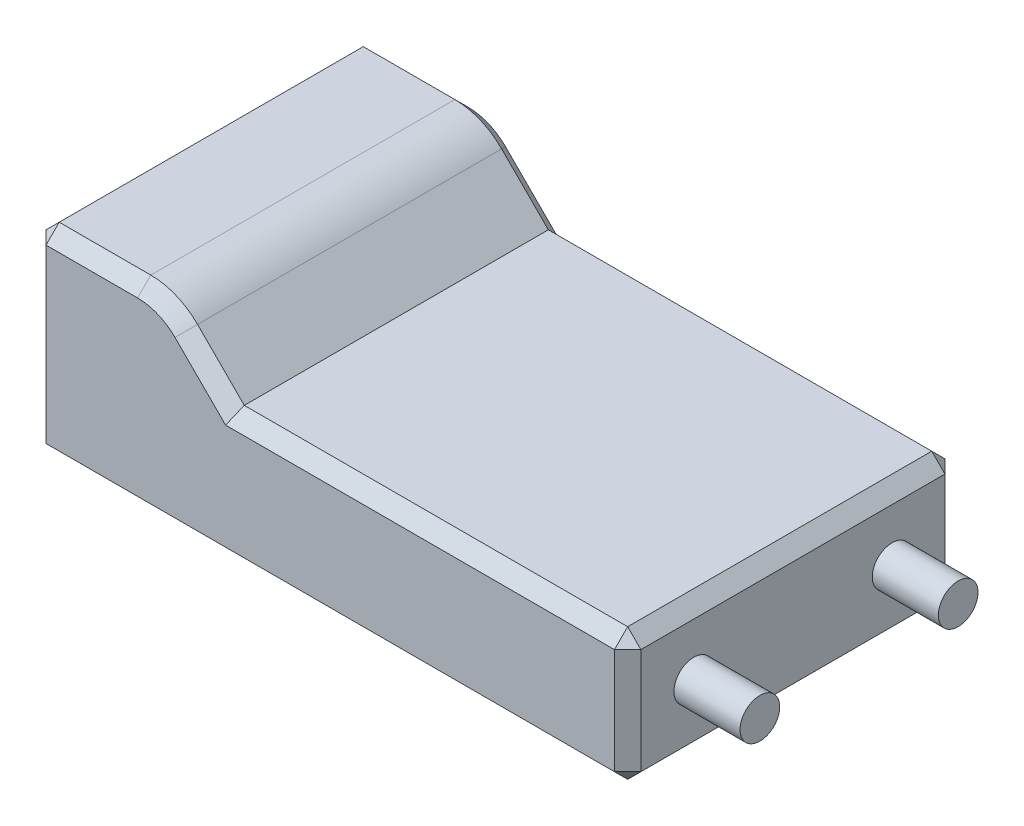
ISO-10303-21;
HEADER;
FILE_DESCRIPTION(('STEP AP214'),'2;1');
FILE_NAME('part.step','',(''),(''),'','','');
FILE_SCHEMA(('AUTOMOTIVE_DESIGN { 1 0 10303 214 1 1 1 1 }'));
ENDSEC;
DATA;
#1=APPLICATION_CONTEXT('core data for automotive mechanical design processes');
#2=APPLICATION_PROTOCOL_DEFINITION('international standard','automotive_design',2000,#1);
#3=PRODUCT_CONTEXT('',#1,'mechanical');
#4=PRODUCT('Part','Part','',(#3));
#5=PRODUCT_RELATED_PRODUCT_CATEGORY('part','',(#4));
#6=PRODUCT_DEFINITION_FORMATION('','',#4);
#7=PRODUCT_DEFINITION_CONTEXT('part definition',#1,'design');
#8=PRODUCT_DEFINITION('design','',#6,#7);
#9=PRODUCT_DEFINITION_SHAPE('','',#8);
#10=(LENGTH_UNIT() NAMED_UNIT(*) SI_UNIT(.MILLI.,.METRE.));
#11=(NAMED_UNIT(*) PLANE_ANGLE_UNIT() SI_UNIT($,.RADIAN.));
#12=(NAMED_UNIT(*) SI_UNIT($,.STERADIAN.) SOLID_ANGLE_UNIT());
#13=UNCERTAINTY_MEASURE_WITH_UNIT(LENGTH_MEASURE(1.E-05),#10,'distance_accuracy_value','');
#14=(GEOMETRIC_REPRESENTATION_CONTEXT(3) GLOBAL_UNCERTAINTY_ASSIGNED_CONTEXT((#13)) GLOBAL_UNIT_ASSIGNED_CONTEXT((#10,
#11,#12)) REPRESENTATION_CONTEXT('',''));
#15=CARTESIAN_POINT('',(0.,0.,0.));
#16=DIRECTION('',(0.,0.,1.));
#17=DIRECTION('',(1.,0.,0.));
#18=AXIS2_PLACEMENT_3D('',#15,#16,#17);
#19=CARTESIAN_POINT('',(-22.5,15.,0.));
#20=DIRECTION('',(1.,0.,0.));
#21=DIRECTION('',(0.,0.,-1.));
#22=AXIS2_PLACEMENT_3D('',#19,#20,#21);
#23=PLANE('',#22);
#24=DIRECTION('',(0.,-1.,0.));
#25=VECTOR('',#24,1.);
#26=CARTESIAN_POINT('',(-22.5,0.,10.));
#27=LINE('',#26,#25);
#28=CARTESIAN_POINT('',(-22.5,14.,10.));
#29=VERTEX_POINT('',#28);
#30=CARTESIAN_POINT('',(-22.5,1.,10.));
#31=VERTEX_POINT('',#30);
#32=EDGE_CURVE('E216',#29,#31,#27,.T.);
#33=ORIENTED_EDGE('',*,*,#32,.T.);
#34=DIRECTION('',(0.,0.,1.));
#35=VECTOR('',#34,1.);
#36=CARTESIAN_POINT('',(-22.5,1.00000000000001,0.));
#37=LINE('',#36,#35);
#38=CARTESIAN_POINT('',(-22.5,1.00000000000001,11.5));
#39=VERTEX_POINT('',#38);
#40=EDGE_CURVE('E320',#31,#39,#37,.T.);
#41=ORIENTED_EDGE('',*,*,#40,.T.);
#42=DIRECTION('',(0.,1.,0.));
#43=VECTOR('',#42,1.);
#44=CARTESIAN_POINT('',(-22.5,15.,11.5));
#45=LINE('',#44,#43);
#46=CARTESIAN_POINT('',(-22.5,14.,11.5));
#47=VERTEX_POINT('',#46);
#48=EDGE_CURVE('E317',#39,#47,#45,.T.);
#49=ORIENTED_EDGE('',*,*,#48,.T.);
#50=DIRECTION('',(0.,0.,-1.));
#51=VECTOR('',#50,1.);
#52=CARTESIAN_POINT('',(-22.5,14.,-12.5));
#53=LINE('',#52,#51);
#54=EDGE_CURVE('E315',#47,#29,#53,.T.);
#55=ORIENTED_EDGE('',*,*,#54,.T.);
#56=EDGE_LOOP('',(#33,#41,#49,#55));
#57=FACE_BOUND('',#56,.T.);
#58=ADVANCED_FACE('F47',(#57),#23,.F.);
#59=CARTESIAN_POINT('',(0.,10.,0.));
#60=DIRECTION('',(0.,1.,0.));
#61=DIRECTION('',(0.,0.,1.));
#62=AXIS2_PLACEMENT_3D('',#59,#60,#61);
#63=PLANE('',#62);
#64=DIRECTION('',(0.,0.,1.));
#65=VECTOR('',#64,1.);
#66=CARTESIAN_POINT('',(-7.49999999999988,10.,-12.5));
#67=LINE('',#66,#65);
#68=CARTESIAN_POINT('',(-7.49999999999988,10.,-11.5));
#69=VERTEX_POINT('',#68);
#70=CARTESIAN_POINT('',(-7.49999999999988,10.,11.5));
#71=VERTEX_POINT('',#70);
#72=EDGE_CURVE('E229',#69,#71,#67,.T.);
#73=ORIENTED_EDGE('',*,*,#72,.T.);
#74=DIRECTION('',(1.,0.,0.));
#75=VECTOR('',#74,1.);
#76=CARTESIAN_POINT('',(22.5,10.,11.5));
#77=LINE('',#76,#75);
#78=CARTESIAN_POINT('',(21.5,10.,11.5));
#79=VERTEX_POINT('',#78);
#80=EDGE_CURVE('E274',#71,#79,#77,.T.);
#81=ORIENTED_EDGE('',*,*,#80,.T.);
#82=DIRECTION('',(0.,0.,-1.));
#83=VECTOR('',#82,1.);
#84=CARTESIAN_POINT('',(21.5,10.,0.));
#85=LINE('',#84,#83);
#86=CARTESIAN_POINT('',(21.5,10.,-11.5));
#87=VERTEX_POINT('',#86);
#88=EDGE_CURVE('E270',#79,#87,#85,.T.);
#89=ORIENTED_EDGE('',*,*,#88,.T.);
#90=DIRECTION('',(-1.,0.,0.));
#91=VECTOR('',#90,1.);
#92=CARTESIAN_POINT('',(0.,10.,-11.5));
#93=LINE('',#92,#91);
#94=EDGE_CURVE('E272',#87,#69,#93,.T.);
#95=ORIENTED_EDGE('',*,*,#94,.T.);
#96=EDGE_LOOP('',(#73,#81,#89,#95));
#97=FACE_BOUND('',#96,.T.);
#98=ADVANCED_FACE('F441',(#97),#63,.T.);
#99=DIRECTION('',(0.,-1.,0.));
#100=VECTOR('',#99,1.);
#101=CARTESIAN_POINT('',(-22.5,0.,-11.5));
#102=LINE('',#101,#100);
#103=CARTESIAN_POINT('',(-22.5,14.,-11.5));
#104=VERTEX_POINT('',#103);
#105=CARTESIAN_POINT('',(-22.5,1.00000000000001,-11.5));
#106=VERTEX_POINT('',#105);
#107=EDGE_CURVE('E311',#104,#106,#102,.T.);
#108=ORIENTED_EDGE('',*,*,#107,.T.);
#109=DIRECTION('',(0.,0.,1.));
#110=VECTOR('',#109,1.);
#111=CARTESIAN_POINT('',(-22.5,1.00000000000001,0.));
#112=LINE('',#111,#110);
#113=CARTESIAN_POINT('',(-22.5,1.,-10.));
#114=VERTEX_POINT('',#113);
#115=EDGE_CURVE('E313',#106,#114,#112,.T.);
#116=ORIENTED_EDGE('',*,*,#115,.T.);
#117=DIRECTION('',(0.,-1.,0.));
#118=VECTOR('',#117,1.);
#119=CARTESIAN_POINT('',(-22.5,0.,-10.));
#120=LINE('',#119,#118);
#121=CARTESIAN_POINT('',(-22.5,14.,-10.));
#122=VERTEX_POINT('',#121);
#123=EDGE_CURVE('E228',#122,#114,#120,.T.);
#124=ORIENTED_EDGE('',*,*,#123,.F.);
#125=DIRECTION('',(0.,0.,-1.));
#126=VECTOR('',#125,1.);
#127=CARTESIAN_POINT('',(-22.5,14.,-12.5));
#128=LINE('',#127,#126);
#129=EDGE_CURVE('E309',#122,#104,#128,.T.);
#130=ORIENTED_EDGE('',*,*,#129,.T.);
#131=EDGE_LOOP('',(#108,#116,#124,#130));
#132=FACE_BOUND('',#131,.T.);
#133=ADVANCED_FACE('F444',(#132),#23,.F.);
#134=CARTESIAN_POINT('',(0.,10.,-12.5));
#135=DIRECTION('',(0.,0.,-1.));
#136=DIRECTION('',(-1.,0.,0.));
#137=AXIS2_PLACEMENT_3D('',#134,#135,#136);
#138=PLANE('',#137);
#139=CARTESIAN_POINT('',(-14.5710678118654,10.,-12.5));
#140=DIRECTION('',(0.,0.,-1.));
#141=DIRECTION('',(-1.,0.,0.));
#142=AXIS2_PLACEMENT_3D('',#139,#140,#141);
#143=CIRCLE('',#142,3.99999999999999);
#144=CARTESIAN_POINT('',(-14.5710678118654,14.,-12.5));
#145=VERTEX_POINT('',#144);
#146=CARTESIAN_POINT('',(-11.7426406871193,12.8284271247462,-12.5));
#147=VERTEX_POINT('',#146);
#148=EDGE_CURVE('E256',#145,#147,#143,.T.);
#149=ORIENTED_EDGE('',*,*,#148,.T.);
#150=DIRECTION('',(0.707106781186556,-0.707106781186539,0.));
#151=VECTOR('',#150,1.);
#152=CARTESIAN_POINT('',(-8.20710678118643,9.29289321881344,-12.5));
#153=LINE('',#152,#151);
#154=CARTESIAN_POINT('',(-7.91421356237297,8.99999999999999,-12.5));
#155=VERTEX_POINT('',#154);
#156=EDGE_CURVE('E258',#147,#155,#153,.T.);
#157=ORIENTED_EDGE('',*,*,#156,.T.);
#158=DIRECTION('',(1.,0.,0.));
#159=VECTOR('',#158,1.);
#160=CARTESIAN_POINT('',(0.,8.99999999999999,-12.5));
#161=LINE('',#160,#159);
#162=CARTESIAN_POINT('',(21.5,8.99999999999999,-12.5));
#163=VERTEX_POINT('',#162);
#164=EDGE_CURVE('E254',#155,#163,#161,.T.);
#165=ORIENTED_EDGE('',*,*,#164,.T.);
#166=DIRECTION('',(0.,-1.,0.));
#167=VECTOR('',#166,1.);
#168=CARTESIAN_POINT('',(21.5,10.,-12.5));
#169=LINE('',#168,#167);
#170=CARTESIAN_POINT('',(21.5,1.00000000000001,-12.5));
#171=VERTEX_POINT('',#170);
#172=EDGE_CURVE('E252',#163,#171,#169,.T.);
#173=ORIENTED_EDGE('',*,*,#172,.T.);
#174=DIRECTION('',(-1.,0.,0.));
#175=VECTOR('',#174,1.);
#176=CARTESIAN_POINT('',(-22.5,1.00000000000001,-12.5));
#177=LINE('',#176,#175);
#178=CARTESIAN_POINT('',(-21.5,1.00000000000001,-12.5));
#179=VERTEX_POINT('',#178);
#180=EDGE_CURVE('E250',#171,#179,#177,.T.);
#181=ORIENTED_EDGE('',*,*,#180,.T.);
#182=DIRECTION('',(0.,1.,0.));
#183=VECTOR('',#182,1.);
#184=CARTESIAN_POINT('',(-21.5,15.,-12.5));
#185=LINE('',#184,#183);
#186=CARTESIAN_POINT('',(-21.5,14.,-12.5));
#187=VERTEX_POINT('',#186);
#188=EDGE_CURVE('E248',#179,#187,#185,.T.);
#189=ORIENTED_EDGE('',*,*,#188,.T.);
#190=DIRECTION('',(1.,0.,0.));
#191=VECTOR('',#190,1.);
#192=CARTESIAN_POINT('',(0.,14.,-12.5));
#193=LINE('',#192,#191);
#194=EDGE_CURVE('E246',#187,#145,#193,.T.);
#195=ORIENTED_EDGE('',*,*,#194,.T.);
#196=EDGE_LOOP('',(#149,#157,#165,#173,#181,#189,#195));
#197=FACE_BOUND('',#196,.T.);
#198=ADVANCED_FACE('F451',(#197),#138,.T.);
#199=CARTESIAN_POINT('',(0.,10.,12.5));
#200=DIRECTION('',(0.,0.,-1.));
#201=DIRECTION('',(-1.,0.,0.));
#202=AXIS2_PLACEMENT_3D('',#199,#200,#201);
#203=PLANE('',#202);
#204=DIRECTION('',(0.,1.,0.));
#205=VECTOR('',#204,1.);
#206=CARTESIAN_POINT('',(21.5,10.,12.5));
#207=LINE('',#206,#205);
#208=CARTESIAN_POINT('',(21.5,1.00000000000001,12.5));
#209=VERTEX_POINT('',#208);
#210=CARTESIAN_POINT('',(21.5,8.99999999999999,12.5));
#211=VERTEX_POINT('',#210);
#212=EDGE_CURVE('E286',#209,#211,#207,.T.);
#213=ORIENTED_EDGE('',*,*,#212,.T.);
#214=DIRECTION('',(-1.,0.,0.));
#215=VECTOR('',#214,1.);
#216=CARTESIAN_POINT('',(-7.49999999999988,8.99999999999999,12.5));
#217=LINE('',#216,#215);
#218=CARTESIAN_POINT('',(-7.91421356237297,8.99999999999999,12.5));
#219=VERTEX_POINT('',#218);
#220=EDGE_CURVE('E288',#211,#219,#217,.T.);
#221=ORIENTED_EDGE('',*,*,#220,.T.);
#222=DIRECTION('',(-0.707106781186556,0.707106781186539,0.));
#223=VECTOR('',#222,1.);
#224=CARTESIAN_POINT('',(-4.45710678118639,5.5428932188135,12.5));
#225=LINE('',#224,#223);
#226=CARTESIAN_POINT('',(-11.7426406871193,12.8284271247462,12.5));
#227=VERTEX_POINT('',#226);
#228=EDGE_CURVE('E280',#219,#227,#225,.T.);
#229=ORIENTED_EDGE('',*,*,#228,.T.);
#230=CARTESIAN_POINT('',(-14.5710678118654,10.,12.5));
#231=DIRECTION('',(0.,0.,-1.));
#232=DIRECTION('',(-1.,0.,0.));
#233=AXIS2_PLACEMENT_3D('',#230,#231,#232);
#234=CIRCLE('',#233,3.99999999999999);
#235=CARTESIAN_POINT('',(-14.5710678118654,14.,12.5));
#236=VERTEX_POINT('',#235);
#237=EDGE_CURVE('E278',#227,#236,#234,.F.);
#238=ORIENTED_EDGE('',*,*,#237,.T.);
#239=DIRECTION('',(-1.,0.,0.));
#240=VECTOR('',#239,1.);
#241=CARTESIAN_POINT('',(-22.5,14.,12.5));
#242=LINE('',#241,#240);
#243=CARTESIAN_POINT('',(-21.5,14.,12.5));
#244=VERTEX_POINT('',#243);
#245=EDGE_CURVE('E276',#236,#244,#242,.T.);
#246=ORIENTED_EDGE('',*,*,#245,.T.);
#247=DIRECTION('',(0.,-1.,0.));
#248=VECTOR('',#247,1.);
#249=CARTESIAN_POINT('',(-21.5,10.,12.5));
#250=LINE('',#249,#248);
#251=CARTESIAN_POINT('',(-21.5,1.00000000000001,12.5));
#252=VERTEX_POINT('',#251);
#253=EDGE_CURVE('E282',#244,#252,#250,.T.);
#254=ORIENTED_EDGE('',*,*,#253,.T.);
#255=DIRECTION('',(1.,0.,0.));
#256=VECTOR('',#255,1.);
#257=CARTESIAN_POINT('',(0.,1.00000000000001,12.5));
#258=LINE('',#257,#256);
#259=EDGE_CURVE('E284',#252,#209,#258,.T.);
#260=ORIENTED_EDGE('',*,*,#259,.T.);
#261=EDGE_LOOP('',(#213,#221,#229,#238,#246,#254,#260));
#262=FACE_BOUND('',#261,.T.);
#263=ADVANCED_FACE('F456',(#262),#203,.F.);
#264=CARTESIAN_POINT('',(22.5,10.,0.));
#265=DIRECTION('',(1.,0.,0.));
#266=DIRECTION('',(0.,0.,-1.));
#267=AXIS2_PLACEMENT_3D('',#264,#265,#266);
#268=PLANE('',#267);
#269=CARTESIAN_POINT('',(22.5,5.00000000000001,-7.49999999999999));
#270=DIRECTION('',(1.,0.,0.));
#271=DIRECTION('',(0.,0.,-1.));
#272=AXIS2_PLACEMENT_3D('',#269,#270,#271);
#273=CIRCLE('',#272,1.5);
#274=CARTESIAN_POINT('',(22.5,5.00000000000001,-8.99999999999999));
#275=VERTEX_POINT('',#274);
#276=EDGE_CURVE('E11',#275,#275,#273,.T.);
#277=ORIENTED_EDGE('',*,*,#276,.F.);
#278=EDGE_LOOP('',(#277));
#279=FACE_BOUND('',#278,.T.);
#280=CARTESIAN_POINT('',(22.5,5.,7.49999999999999));
#281=DIRECTION('',(1.,0.,0.));
#282=DIRECTION('',(0.,0.,-1.));
#283=AXIS2_PLACEMENT_3D('',#280,#281,#282);
#284=CIRCLE('',#283,1.5);
#285=CARTESIAN_POINT('',(22.5,5.,5.99999999999999));
#286=VERTEX_POINT('',#285);
#287=EDGE_CURVE('E420',#286,#286,#284,.T.);
#288=ORIENTED_EDGE('',*,*,#287,.F.);
#289=EDGE_LOOP('',(#288));
#290=FACE_BOUND('',#289,.T.);
#291=DIRECTION('',(0.,0.,1.));
#292=VECTOR('',#291,1.);
#293=CARTESIAN_POINT('',(22.5,8.99999999999999,0.));
#294=LINE('',#293,#292);
#295=CARTESIAN_POINT('',(22.5,8.99999999999999,-11.5));
#296=VERTEX_POINT('',#295);
#297=CARTESIAN_POINT('',(22.5,8.99999999999999,11.5));
#298=VERTEX_POINT('',#297);
#299=EDGE_CURVE('E293',#296,#298,#294,.T.);
#300=ORIENTED_EDGE('',*,*,#299,.T.);
#301=DIRECTION('',(0.,-1.,0.));
#302=VECTOR('',#301,1.);
#303=CARTESIAN_POINT('',(22.5,0.,11.5));
#304=LINE('',#303,#302);
#305=CARTESIAN_POINT('',(22.5,1.00000000000001,11.5));
#306=VERTEX_POINT('',#305);
#307=EDGE_CURVE('E297',#298,#306,#304,.T.);
#308=ORIENTED_EDGE('',*,*,#307,.T.);
#309=DIRECTION('',(0.,0.,-1.));
#310=VECTOR('',#309,1.);
#311=CARTESIAN_POINT('',(22.5,1.00000000000001,-12.5));
#312=LINE('',#311,#310);
#313=CARTESIAN_POINT('',(22.5,1.00000000000001,-11.5));
#314=VERTEX_POINT('',#313);
#315=EDGE_CURVE('E295',#306,#314,#312,.T.);
#316=ORIENTED_EDGE('',*,*,#315,.T.);
#317=DIRECTION('',(0.,1.,0.));
#318=VECTOR('',#317,1.);
#319=CARTESIAN_POINT('',(22.5,10.,-11.5));
#320=LINE('',#319,#318);
#321=EDGE_CURVE('E291',#314,#296,#320,.T.);
#322=ORIENTED_EDGE('',*,*,#321,.T.);
#323=EDGE_LOOP('',(#300,#308,#316,#322));
#324=FACE_BOUND('',#323,.T.);
#325=ADVANCED_FACE('F503',(#279,#290,#324),#268,.T.);
#326=CARTESIAN_POINT('',(0.,0.,0.));
#327=DIRECTION('',(0.,1.,0.));
#328=DIRECTION('',(0.,0.,1.));
#329=AXIS2_PLACEMENT_3D('',#326,#327,#328);
#330=PLANE('',#329);
#331=DIRECTION('',(0.,0.,1.));
#332=VECTOR('',#331,1.);
#333=CARTESIAN_POINT('',(21.5,0.,12.5));
#334=LINE('',#333,#332);
#335=CARTESIAN_POINT('',(21.5,0.,-11.5));
#336=VERTEX_POINT('',#335);
#337=CARTESIAN_POINT('',(21.5,0.,11.5));
#338=VERTEX_POINT('',#337);
#339=EDGE_CURVE('E302',#336,#338,#334,.T.);
#340=ORIENTED_EDGE('',*,*,#339,.T.);
#341=DIRECTION('',(-1.,0.,0.));
#342=VECTOR('',#341,1.);
#343=CARTESIAN_POINT('',(0.,0.,11.5));
#344=LINE('',#343,#342);
#345=CARTESIAN_POINT('',(-21.5,0.,11.5));
#346=VERTEX_POINT('',#345);
#347=EDGE_CURVE('E306',#338,#346,#344,.T.);
#348=ORIENTED_EDGE('',*,*,#347,.T.);
#349=DIRECTION('',(0.,0.,-1.));
#350=VECTOR('',#349,1.);
#351=CARTESIAN_POINT('',(-21.5,0.,0.));
#352=LINE('',#351,#350);
#353=CARTESIAN_POINT('',(-21.5,0.,-11.5));
#354=VERTEX_POINT('',#353);
#355=EDGE_CURVE('E304',#346,#354,#352,.T.);
#356=ORIENTED_EDGE('',*,*,#355,.T.);
#357=DIRECTION('',(1.,0.,0.));
#358=VECTOR('',#357,1.);
#359=CARTESIAN_POINT('',(22.5,0.,-11.5));
#360=LINE('',#359,#358);
#361=EDGE_CURVE('E300',#354,#336,#360,.T.);
#362=ORIENTED_EDGE('',*,*,#361,.T.);
#363=EDGE_LOOP('',(#340,#348,#356,#362));
#364=FACE_BOUND('',#363,.T.);
#365=ADVANCED_FACE('F487',(#364),#330,.F.);
#366=CARTESIAN_POINT('',(0.,15.,0.));
#367=DIRECTION('',(0.,1.,0.));
#368=DIRECTION('',(0.,0.,1.));
#369=AXIS2_PLACEMENT_3D('',#366,#367,#368);
#370=PLANE('',#369);
#371=DIRECTION('',(0.,0.,1.));
#372=VECTOR('',#371,1.);
#373=CARTESIAN_POINT('',(-21.5,15.,12.5));
#374=LINE('',#373,#372);
#375=CARTESIAN_POINT('',(-21.5,15.,-11.5));
#376=VERTEX_POINT('',#375);
#377=CARTESIAN_POINT('',(-21.5,15.,11.5));
#378=VERTEX_POINT('',#377);
#379=EDGE_CURVE('E63',#376,#378,#374,.T.);
#380=ORIENTED_EDGE('',*,*,#379,.T.);
#381=DIRECTION('',(1.,0.,0.));
#382=VECTOR('',#381,1.);
#383=CARTESIAN_POINT('',(-14.5710678118654,15.,11.5));
#384=LINE('',#383,#382);
#385=CARTESIAN_POINT('',(-14.5710678118654,15.,11.5));
#386=VERTEX_POINT('',#385);
#387=EDGE_CURVE('E56',#378,#386,#384,.T.);
#388=ORIENTED_EDGE('',*,*,#387,.T.);
#389=DIRECTION('',(0.,0.,1.));
#390=VECTOR('',#389,1.);
#391=CARTESIAN_POINT('',(-14.5710678118654,15.,-12.5));
#392=LINE('',#391,#390);
#393=CARTESIAN_POINT('',(-14.5710678118654,15.,-11.5));
#394=VERTEX_POINT('',#393);
#395=EDGE_CURVE('E244',#386,#394,#392,.F.);
#396=ORIENTED_EDGE('',*,*,#395,.T.);
#397=DIRECTION('',(-1.,0.,0.));
#398=VECTOR('',#397,1.);
#399=CARTESIAN_POINT('',(0.,15.,-11.5));
#400=LINE('',#399,#398);
#401=EDGE_CURVE('E68',#394,#376,#400,.T.);
#402=ORIENTED_EDGE('',*,*,#401,.T.);
#403=EDGE_LOOP('',(#380,#388,#396,#402));
#404=FACE_BOUND('',#403,.T.);
#405=ADVANCED_FACE('F539',(#404),#370,.T.);
#406=CARTESIAN_POINT('',(-15.5,14.,0.));
#407=DIRECTION('',(0.,-1.,0.));
#408=DIRECTION('',(0.,0.,-1.));
#409=AXIS2_PLACEMENT_3D('',#406,#407,#408);
#410=PLANE('',#409);
#411=DIRECTION('',(0.,0.,1.));
#412=VECTOR('',#411,1.);
#413=CARTESIAN_POINT('',(-22.5,14.,0.));
#414=LINE('',#413,#412);
#415=EDGE_CURVE('E203',#122,#29,#414,.T.);
#416=ORIENTED_EDGE('',*,*,#415,.F.);
#417=DIRECTION('',(-1.,0.,0.));
#418=VECTOR('',#417,1.);
#419=CARTESIAN_POINT('',(-15.5,14.,-10.));
#420=LINE('',#419,#418);
#421=CARTESIAN_POINT('',(-15.5,14.,-10.));
#422=VERTEX_POINT('',#421);
#423=EDGE_CURVE('E196',#422,#122,#420,.T.);
#424=ORIENTED_EDGE('',*,*,#423,.F.);
#425=DIRECTION('',(0.,0.,1.));
#426=VECTOR('',#425,1.);
#427=CARTESIAN_POINT('',(-15.5,14.,0.));
#428=LINE('',#427,#426);
#429=CARTESIAN_POINT('',(-15.5,14.,10.));
#430=VERTEX_POINT('',#429);
#431=EDGE_CURVE('E200',#422,#430,#428,.T.);
#432=ORIENTED_EDGE('',*,*,#431,.T.);
#433=DIRECTION('',(-1.,0.,0.));
#434=VECTOR('',#433,1.);
#435=CARTESIAN_POINT('',(-15.5,14.,10.));
#436=LINE('',#435,#434);
#437=EDGE_CURVE('E236',#430,#29,#436,.T.);
#438=ORIENTED_EDGE('',*,*,#437,.T.);
#439=EDGE_LOOP('',(#416,#424,#432,#438));
#440=FACE_BOUND('',#439,.T.);
#441=ADVANCED_FACE('F198',(#440),#410,.T.);
#442=CARTESIAN_POINT('',(-15.5,0.,10.));
#443=DIRECTION('',(0.,0.,-1.));
#444=DIRECTION('',(-1.,0.,0.));
#445=AXIS2_PLACEMENT_3D('',#442,#443,#444);
#446=PLANE('',#445);
#447=ORIENTED_EDGE('',*,*,#32,.F.);
#448=ORIENTED_EDGE('',*,*,#437,.F.);
#449=DIRECTION('',(0.,-1.,0.));
#450=VECTOR('',#449,1.);
#451=CARTESIAN_POINT('',(-15.5,0.,10.));
#452=LINE('',#451,#450);
#453=CARTESIAN_POINT('',(-15.5,1.,10.));
#454=VERTEX_POINT('',#453);
#455=EDGE_CURVE('E209',#430,#454,#452,.T.);
#456=ORIENTED_EDGE('',*,*,#455,.T.);
#457=DIRECTION('',(-1.,0.,0.));
#458=VECTOR('',#457,1.);
#459=CARTESIAN_POINT('',(-15.5,1.,10.));
#460=LINE('',#459,#458);
#461=EDGE_CURVE('E239',#454,#31,#460,.T.);
#462=ORIENTED_EDGE('',*,*,#461,.T.);
#463=EDGE_LOOP('',(#447,#448,#456,#462));
#464=FACE_BOUND('',#463,.T.);
#465=ADVANCED_FACE('F986',(#464),#446,.T.);
#466=CARTESIAN_POINT('',(-15.5,1.,0.));
#467=DIRECTION('',(0.,-1.,0.));
#468=DIRECTION('',(0.,0.,-1.));
#469=AXIS2_PLACEMENT_3D('',#466,#467,#468);
#470=PLANE('',#469);
#471=DIRECTION('',(0.,0.,1.));
#472=VECTOR('',#471,1.);
#473=CARTESIAN_POINT('',(-22.5,1.,0.));
#474=LINE('',#473,#472);
#475=EDGE_CURVE('E231',#114,#31,#474,.T.);
#476=ORIENTED_EDGE('',*,*,#475,.T.);
#477=ORIENTED_EDGE('',*,*,#461,.F.);
#478=DIRECTION('',(0.,0.,1.));
#479=VECTOR('',#478,1.);
#480=CARTESIAN_POINT('',(-15.5,1.,0.));
#481=LINE('',#480,#479);
#482=CARTESIAN_POINT('',(-15.5,1.,-10.));
#483=VERTEX_POINT('',#482);
#484=EDGE_CURVE('E221',#483,#454,#481,.T.);
#485=ORIENTED_EDGE('',*,*,#484,.F.);
#486=DIRECTION('',(-1.,0.,0.));
#487=VECTOR('',#486,1.);
#488=CARTESIAN_POINT('',(-15.5,1.,-10.));
#489=LINE('',#488,#487);
#490=EDGE_CURVE('E208',#483,#114,#489,.T.);
#491=ORIENTED_EDGE('',*,*,#490,.T.);
#492=EDGE_LOOP('',(#476,#477,#485,#491));
#493=FACE_BOUND('',#492,.T.);
#494=ADVANCED_FACE('F977',(#493),#470,.F.);
#495=CARTESIAN_POINT('',(-15.5,0.,-10.));
#496=DIRECTION('',(0.,0.,-1.));
#497=DIRECTION('',(-1.,0.,0.));
#498=AXIS2_PLACEMENT_3D('',#495,#496,#497);
#499=PLANE('',#498);
#500=ORIENTED_EDGE('',*,*,#123,.T.);
#501=ORIENTED_EDGE('',*,*,#490,.F.);
#502=DIRECTION('',(0.,-1.,0.));
#503=VECTOR('',#502,1.);
#504=CARTESIAN_POINT('',(-15.5,0.,-10.));
#505=LINE('',#504,#503);
#506=EDGE_CURVE('E215',#422,#483,#505,.T.);
#507=ORIENTED_EDGE('',*,*,#506,.F.);
#508=ORIENTED_EDGE('',*,*,#423,.T.);
#509=EDGE_LOOP('',(#500,#501,#507,#508));
#510=FACE_BOUND('',#509,.T.);
#511=ADVANCED_FACE('F218',(#510),#499,.F.);
#512=CARTESIAN_POINT('',(-15.5,0.,0.));
#513=DIRECTION('',(-1.,0.,0.));
#514=DIRECTION('',(0.,0.,1.));
#515=AXIS2_PLACEMENT_3D('',#512,#513,#514);
#516=PLANE('',#515);
#517=ORIENTED_EDGE('',*,*,#431,.F.);
#518=ORIENTED_EDGE('',*,*,#506,.T.);
#519=ORIENTED_EDGE('',*,*,#484,.T.);
#520=ORIENTED_EDGE('',*,*,#455,.F.);
#521=EDGE_LOOP('',(#517,#518,#519,#520));
#522=FACE_BOUND('',#521,.T.);
#523=ADVANCED_FACE('F213',(#522),#516,.T.);
#524=CARTESIAN_POINT('',(1.25000000000015,1.25000000000018,-12.5));
#525=DIRECTION('',(-0.707106781186539,-0.707106781186556,0.));
#526=DIRECTION('',(0.707106781186556,-0.707106781186539,0.));
#527=AXIS2_PLACEMENT_3D('',#524,#525,#526);
#528=PLANE('',#527);
#529=ORIENTED_EDGE('',*,*,#72,.F.);
#530=DIRECTION('',(-0.707106781186556,0.707106781186539,0.));
#531=VECTOR('',#530,1.);
#532=CARTESIAN_POINT('',(-11.0355339059327,13.5355339059328,-11.5));
#533=LINE('',#532,#531);
#534=CARTESIAN_POINT('',(-11.0355339059327,13.5355339059328,-11.5));
#535=VERTEX_POINT('',#534);
#536=EDGE_CURVE('E263',#69,#535,#533,.T.);
#537=ORIENTED_EDGE('',*,*,#536,.T.);
#538=DIRECTION('',(0.,0.,1.));
#539=VECTOR('',#538,1.);
#540=CARTESIAN_POINT('',(-11.0355339059327,13.5355339059328,12.5));
#541=LINE('',#540,#539);
#542=CARTESIAN_POINT('',(-11.0355339059327,13.5355339059328,11.5));
#543=VERTEX_POINT('',#542);
#544=EDGE_CURVE('E238',#535,#543,#541,.T.);
#545=ORIENTED_EDGE('',*,*,#544,.T.);
#546=DIRECTION('',(0.707106781186556,-0.707106781186539,0.));
#547=VECTOR('',#546,1.);
#548=CARTESIAN_POINT('',(1.25000000000015,1.25000000000018,11.5));
#549=LINE('',#548,#547);
#550=EDGE_CURVE('E261',#543,#71,#549,.T.);
#551=ORIENTED_EDGE('',*,*,#550,.T.);
#552=EDGE_LOOP('',(#529,#537,#545,#551));
#553=FACE_BOUND('',#552,.T.);
#554=ADVANCED_FACE('F524',(#553),#528,.F.);
#555=CARTESIAN_POINT('',(-14.5710678118654,10.,-12.5));
#556=DIRECTION('',(0.,0.,-1.));
#557=DIRECTION('',(-1.,0.,0.));
#558=AXIS2_PLACEMENT_3D('',#555,#556,#557);
#559=CYLINDRICAL_SURFACE('',#558,5.);
#560=ORIENTED_EDGE('',*,*,#544,.F.);
#561=CARTESIAN_POINT('',(-14.5710678118654,10.,-11.5));
#562=DIRECTION('',(0.,0.,-1.));
#563=DIRECTION('',(-1.,0.,0.));
#564=AXIS2_PLACEMENT_3D('',#561,#562,#563);
#565=CIRCLE('',#564,5.);
#566=EDGE_CURVE('E268',#535,#394,#565,.F.);
#567=ORIENTED_EDGE('',*,*,#566,.T.);
#568=ORIENTED_EDGE('',*,*,#395,.F.);
#569=CARTESIAN_POINT('',(-14.5710678118654,10.,11.5));
#570=DIRECTION('',(0.,0.,-1.));
#571=DIRECTION('',(-1.,0.,0.));
#572=AXIS2_PLACEMENT_3D('',#569,#570,#571);
#573=CIRCLE('',#572,5.);
#574=EDGE_CURVE('E266',#386,#543,#573,.T.);
#575=ORIENTED_EDGE('',*,*,#574,.T.);
#576=EDGE_LOOP('',(#560,#567,#568,#575));
#577=FACE_BOUND('',#576,.T.);
#578=ADVANCED_FACE('F537',(#577),#559,.T.);
#579=CARTESIAN_POINT('',(-21.5,0.,11.5));
#580=DIRECTION('',(-0.577350269189626,-0.577350269189626,0.577350269189626));
#581=DIRECTION('',(0.707106781186547,0.,0.707106781186547));
#582=AXIS2_PLACEMENT_3D('',#579,#580,#581);
#583=PLANE('',#582);
#584=DIRECTION('',(-0.707106781186547,0.707106781186547,0.));
#585=VECTOR('',#584,1.);
#586=CARTESIAN_POINT('',(-21.5,0.,11.5));
#587=LINE('',#586,#585);
#588=EDGE_CURVE('E401',#346,#39,#587,.T.);
#589=ORIENTED_EDGE('',*,*,#588,.F.);
#590=DIRECTION('',(0.,-0.707106781186547,-0.707106781186547));
#591=VECTOR('',#590,1.);
#592=CARTESIAN_POINT('',(-21.5,0.,11.5));
#593=LINE('',#592,#591);
#594=EDGE_CURVE('E409',#252,#346,#593,.T.);
#595=ORIENTED_EDGE('',*,*,#594,.F.);
#596=DIRECTION('',(0.707106781186547,0.,0.707106781186547));
#597=VECTOR('',#596,1.);
#598=CARTESIAN_POINT('',(-22.,1.00000000000001,12.));
#599=LINE('',#598,#597);
#600=EDGE_CURVE('E404',#39,#252,#599,.T.);
#601=ORIENTED_EDGE('',*,*,#600,.F.);
#602=EDGE_LOOP('',(#589,#595,#601));
#603=FACE_BOUND('',#602,.T.);
#604=ADVANCED_FACE('F50',(#603),#583,.T.);
#605=CARTESIAN_POINT('',(0.,1.00000000000001,12.5));
#606=DIRECTION('',(0.,0.707106781186547,-0.707106781186547));
#607=DIRECTION('',(1.,0.,0.));
#608=AXIS2_PLACEMENT_3D('',#605,#606,#607);
#609=PLANE('',#608);
#610=ORIENTED_EDGE('',*,*,#594,.T.);
#611=ORIENTED_EDGE('',*,*,#347,.F.);
#612=DIRECTION('',(0.,0.707106781186547,0.707106781186547));
#613=VECTOR('',#612,1.);
#614=CARTESIAN_POINT('',(21.5,0.500000000000004,12.));
#615=LINE('',#614,#613);
#616=EDGE_CURVE('E398',#209,#338,#615,.F.);
#617=ORIENTED_EDGE('',*,*,#616,.F.);
#618=ORIENTED_EDGE('',*,*,#259,.F.);
#619=EDGE_LOOP('',(#610,#611,#617,#618));
#620=FACE_BOUND('',#619,.T.);
#621=ADVANCED_FACE('F559',(#620),#609,.F.);
#622=CARTESIAN_POINT('',(-14.5710678118654,10.,12.5));
#623=DIRECTION('',(0.,0.,-1.));
#624=DIRECTION('',(-1.,0.,0.));
#625=AXIS2_PLACEMENT_3D('',#622,#623,#624);
#626=CONICAL_SURFACE('',#625,3.99999999999999,0.785398163397448);
#627=DIRECTION('',(-0.499999999999994,-0.500000000000006,0.707106781186548));
#628=VECTOR('',#627,1.);
#629=CARTESIAN_POINT('',(-11.0355339059327,13.5355339059328,11.5));
#630=LINE('',#629,#628);
#631=EDGE_CURVE('E395',#543,#227,#630,.T.);
#632=ORIENTED_EDGE('',*,*,#631,.F.);
#633=ORIENTED_EDGE('',*,*,#574,.F.);
#634=DIRECTION('',(0.,0.707106781186547,-0.707106781186547));
#635=VECTOR('',#634,1.);
#636=CARTESIAN_POINT('',(-14.5710678118654,14.,12.5));
#637=LINE('',#636,#635);
#638=EDGE_CURVE('E407',#236,#386,#637,.T.);
#639=ORIENTED_EDGE('',*,*,#638,.F.);
#640=ORIENTED_EDGE('',*,*,#237,.F.);
#641=EDGE_LOOP('',(#632,#633,#639,#640));
#642=FACE_BOUND('',#641,.T.);
#643=ADVANCED_FACE('F569',(#642),#626,.T.);
#644=CARTESIAN_POINT('',(0.,15.,11.5));
#645=DIRECTION('',(0.,0.707106781186547,0.707106781186547));
#646=DIRECTION('',(-1.,0.,0.));
#647=AXIS2_PLACEMENT_3D('',#644,#645,#646);
#648=PLANE('',#647);
#649=ORIENTED_EDGE('',*,*,#638,.T.);
#650=ORIENTED_EDGE('',*,*,#387,.F.);
#651=DIRECTION('',(0.,0.707106781186547,-0.707106781186547));
#652=VECTOR('',#651,1.);
#653=CARTESIAN_POINT('',(-21.5,14.5,12.));
#654=LINE('',#653,#652);
#655=EDGE_CURVE('E392',#244,#378,#654,.T.);
#656=ORIENTED_EDGE('',*,*,#655,.F.);
#657=ORIENTED_EDGE('',*,*,#245,.F.);
#658=EDGE_LOOP('',(#649,#650,#656,#657));
#659=FACE_BOUND('',#658,.T.);
#660=ADVANCED_FACE('F566',(#659),#648,.T.);
#661=CARTESIAN_POINT('',(-21.5,10.,12.5));
#662=DIRECTION('',(0.707106781186547,0.,-0.707106781186547));
#663=DIRECTION('',(0.,-1.,0.));
#664=AXIS2_PLACEMENT_3D('',#661,#662,#663);
#665=PLANE('',#664);
#666=ORIENTED_EDGE('',*,*,#600,.T.);
#667=ORIENTED_EDGE('',*,*,#253,.F.);
#668=DIRECTION('',(-0.707106781186547,0.,-0.707106781186547));
#669=VECTOR('',#668,1.);
#670=CARTESIAN_POINT('',(-22.5,14.,11.5));
#671=LINE('',#670,#669);
#672=EDGE_CURVE('E389',#47,#244,#671,.F.);
#673=ORIENTED_EDGE('',*,*,#672,.F.);
#674=ORIENTED_EDGE('',*,*,#48,.F.);
#675=EDGE_LOOP('',(#666,#667,#673,#674));
#676=FACE_BOUND('',#675,.T.);
#677=ADVANCED_FACE('F554',(#676),#665,.F.);
#678=CARTESIAN_POINT('',(-22.5,1.00000000000001,0.));
#679=DIRECTION('',(0.707106781186547,0.707106781186547,0.));
#680=DIRECTION('',(0.,0.,1.));
#681=AXIS2_PLACEMENT_3D('',#678,#679,#680);
#682=PLANE('',#681);
#683=ORIENTED_EDGE('',*,*,#475,.F.);
#684=ORIENTED_EDGE('',*,*,#115,.F.);
#685=DIRECTION('',(0.707106781186547,-0.707106781186547,0.));
#686=VECTOR('',#685,1.);
#687=CARTESIAN_POINT('',(-21.5,0.,-11.5));
#688=LINE('',#687,#686);
#689=EDGE_CURVE('E386',#354,#106,#688,.F.);
#690=ORIENTED_EDGE('',*,*,#689,.F.);
#691=ORIENTED_EDGE('',*,*,#355,.F.);
#692=ORIENTED_EDGE('',*,*,#588,.T.);
#693=ORIENTED_EDGE('',*,*,#40,.F.);
#694=EDGE_LOOP('',(#683,#684,#690,#691,#692,#693));
#695=FACE_BOUND('',#694,.T.);
#696=ADVANCED_FACE('F468',(#695),#682,.F.);
#697=CARTESIAN_POINT('',(22.5,1.00000000000001,11.5));
#698=DIRECTION('',(0.577350269189626,-0.577350269189626,0.577350269189626));
#699=DIRECTION('',(0.707106781186547,0.,-0.707106781186547));
#700=AXIS2_PLACEMENT_3D('',#697,#698,#699);
#701=PLANE('',#700);
#702=DIRECTION('',(-0.707106781186547,0.,0.707106781186547));
#703=VECTOR('',#702,1.);
#704=CARTESIAN_POINT('',(22.5,1.00000000000001,11.5));
#705=LINE('',#704,#703);
#706=EDGE_CURVE('E377',#209,#306,#705,.F.);
#707=ORIENTED_EDGE('',*,*,#706,.F.);
#708=ORIENTED_EDGE('',*,*,#616,.T.);
#709=DIRECTION('',(0.707106781186547,0.707106781186547,0.));
#710=VECTOR('',#709,1.);
#711=CARTESIAN_POINT('',(22.5,1.00000000000001,11.5));
#712=LINE('',#711,#710);
#713=EDGE_CURVE('E380',#306,#338,#712,.F.);
#714=ORIENTED_EDGE('',*,*,#713,.F.);
#715=EDGE_LOOP('',(#707,#708,#714));
#716=FACE_BOUND('',#715,.T.);
#717=ADVANCED_FACE('F495',(#716),#701,.T.);
#718=CARTESIAN_POINT('',(1.25000000000015,1.25000000000018,11.5));
#719=DIRECTION('',(-0.499999999999994,-0.500000000000006,-0.707106781186547));
#720=DIRECTION('',(0.707106781186556,-0.707106781186539,0.));
#721=AXIS2_PLACEMENT_3D('',#718,#719,#720);
#722=PLANE('',#721);
#723=ORIENTED_EDGE('',*,*,#631,.T.);
#724=ORIENTED_EDGE('',*,*,#228,.F.);
#725=DIRECTION('',(-0.281084637714816,-0.678598344545848,0.678598344545848));
#726=VECTOR('',#725,1.);
#727=CARTESIAN_POINT('',(-6.90743569830537,11.4305767737291,10.0694232262709));
#728=LINE('',#727,#726);
#729=EDGE_CURVE('E375',#71,#219,#728,.T.);
#730=ORIENTED_EDGE('',*,*,#729,.F.);
#731=ORIENTED_EDGE('',*,*,#550,.F.);
#732=EDGE_LOOP('',(#723,#724,#730,#731));
#733=FACE_BOUND('',#732,.T.);
#734=ADVANCED_FACE('F572',(#733),#722,.F.);
#735=CARTESIAN_POINT('',(-22.5,14.,11.5));
#736=DIRECTION('',(-0.577350269189626,0.577350269189626,0.577350269189626));
#737=DIRECTION('',(0.707106781186547,0.,0.707106781186547));
#738=AXIS2_PLACEMENT_3D('',#735,#736,#737);
#739=PLANE('',#738);
#740=ORIENTED_EDGE('',*,*,#672,.T.);
#741=ORIENTED_EDGE('',*,*,#655,.T.);
#742=DIRECTION('',(-0.707106781186547,-0.707106781186547,0.));
#743=VECTOR('',#742,1.);
#744=CARTESIAN_POINT('',(-22.5,14.,11.5));
#745=LINE('',#744,#743);
#746=EDGE_CURVE('E372',#47,#378,#745,.F.);
#747=ORIENTED_EDGE('',*,*,#746,.F.);
#748=EDGE_LOOP('',(#740,#741,#747));
#749=FACE_BOUND('',#748,.T.);
#750=ADVANCED_FACE('F549',(#749),#739,.T.);
#751=CARTESIAN_POINT('',(-21.5,0.,-11.5));
#752=DIRECTION('',(-0.577350269189626,-0.577350269189626,-0.577350269189626));
#753=DIRECTION('',(-0.707106781186547,0.,0.707106781186547));
#754=AXIS2_PLACEMENT_3D('',#751,#752,#753);
#755=PLANE('',#754);
#756=DIRECTION('',(0.707106781186547,0.,-0.707106781186547));
#757=VECTOR('',#756,1.);
#758=CARTESIAN_POINT('',(-22.,1.00000000000001,-12.));
#759=LINE('',#758,#757);
#760=EDGE_CURVE('E369',#179,#106,#759,.F.);
#761=ORIENTED_EDGE('',*,*,#760,.F.);
#762=DIRECTION('',(0.,-0.707106781186547,0.707106781186547));
#763=VECTOR('',#762,1.);
#764=CARTESIAN_POINT('',(-21.5,0.,-11.5));
#765=LINE('',#764,#763);
#766=EDGE_CURVE('E383',#354,#179,#765,.F.);
#767=ORIENTED_EDGE('',*,*,#766,.F.);
#768=ORIENTED_EDGE('',*,*,#689,.T.);
#769=EDGE_LOOP('',(#761,#767,#768));
#770=FACE_BOUND('',#769,.T.);
#771=ADVANCED_FACE('F473',(#770),#755,.T.);
#772=CARTESIAN_POINT('',(0.,0.,-11.5));
#773=DIRECTION('',(0.,-0.707106781186547,-0.707106781186547));
#774=DIRECTION('',(-1.,0.,0.));
#775=AXIS2_PLACEMENT_3D('',#772,#773,#774);
#776=PLANE('',#775);
#777=ORIENTED_EDGE('',*,*,#766,.T.);
#778=ORIENTED_EDGE('',*,*,#180,.F.);
#779=DIRECTION('',(0.,0.707106781186547,-0.707106781186547));
#780=VECTOR('',#779,1.);
#781=CARTESIAN_POINT('',(21.5,0.500000000000004,-12.));
#782=LINE('',#781,#780);
#783=EDGE_CURVE('E366',#336,#171,#782,.T.);
#784=ORIENTED_EDGE('',*,*,#783,.F.);
#785=ORIENTED_EDGE('',*,*,#361,.F.);
#786=EDGE_LOOP('',(#777,#778,#784,#785));
#787=FACE_BOUND('',#786,.T.);
#788=ADVANCED_FACE('F484',(#787),#776,.T.);
#789=CARTESIAN_POINT('',(21.5,0.,0.));
#790=DIRECTION('',(0.707106781186547,-0.707106781186547,0.));
#791=DIRECTION('',(0.,0.,-1.));
#792=AXIS2_PLACEMENT_3D('',#789,#790,#791);
#793=PLANE('',#792);
#794=ORIENTED_EDGE('',*,*,#713,.T.);
#795=ORIENTED_EDGE('',*,*,#339,.F.);
#796=DIRECTION('',(-0.707106781186547,-0.707106781186547,0.));
#797=VECTOR('',#796,1.);
#798=CARTESIAN_POINT('',(22.5,1.00000000000001,-11.5));
#799=LINE('',#798,#797);
#800=EDGE_CURVE('E363',#314,#336,#799,.T.);
#801=ORIENTED_EDGE('',*,*,#800,.F.);
#802=ORIENTED_EDGE('',*,*,#315,.F.);
#803=EDGE_LOOP('',(#794,#795,#801,#802));
#804=FACE_BOUND('',#803,.T.);
#805=ADVANCED_FACE('F490',(#804),#793,.T.);
#806=CARTESIAN_POINT('',(22.5,10.,11.5));
#807=DIRECTION('',(0.707106781186547,0.,0.707106781186547));
#808=DIRECTION('',(0.,1.,0.));
#809=AXIS2_PLACEMENT_3D('',#806,#807,#808);
#810=PLANE('',#809);
#811=ORIENTED_EDGE('',*,*,#706,.T.);
#812=ORIENTED_EDGE('',*,*,#307,.F.);
#813=DIRECTION('',(0.707106781186547,0.,-0.707106781186547));
#814=VECTOR('',#813,1.);
#815=CARTESIAN_POINT('',(22.,8.99999999999999,12.));
#816=LINE('',#815,#814);
#817=EDGE_CURVE('E360',#211,#298,#816,.T.);
#818=ORIENTED_EDGE('',*,*,#817,.F.);
#819=ORIENTED_EDGE('',*,*,#212,.F.);
#820=EDGE_LOOP('',(#811,#812,#818,#819));
#821=FACE_BOUND('',#820,.T.);
#822=ADVANCED_FACE('F500',(#821),#810,.T.);
#823=CARTESIAN_POINT('',(0.,10.,11.5));
#824=DIRECTION('',(0.,0.707106781186547,0.707106781186547));
#825=DIRECTION('',(-1.,0.,0.));
#826=AXIS2_PLACEMENT_3D('',#823,#824,#825);
#827=PLANE('',#826);
#828=ORIENTED_EDGE('',*,*,#729,.T.);
#829=ORIENTED_EDGE('',*,*,#220,.F.);
#830=DIRECTION('',(0.,-0.707106781186547,0.707106781186547));
#831=VECTOR('',#830,1.);
#832=CARTESIAN_POINT('',(21.5,10.,11.5));
#833=LINE('',#832,#831);
#834=EDGE_CURVE('E357',#79,#211,#833,.T.);
#835=ORIENTED_EDGE('',*,*,#834,.F.);
#836=ORIENTED_EDGE('',*,*,#80,.F.);
#837=EDGE_LOOP('',(#828,#829,#835,#836));
#838=FACE_BOUND('',#837,.T.);
#839=ADVANCED_FACE('F576',(#838),#827,.T.);
#840=CARTESIAN_POINT('',(-21.5,15.,0.));
#841=DIRECTION('',(-0.707106781186547,0.707106781186547,0.));
#842=DIRECTION('',(0.,0.,-1.));
#843=AXIS2_PLACEMENT_3D('',#840,#841,#842);
#844=PLANE('',#843);
#845=ORIENTED_EDGE('',*,*,#746,.T.);
#846=ORIENTED_EDGE('',*,*,#379,.F.);
#847=DIRECTION('',(0.707106781186547,0.707106781186547,0.));
#848=VECTOR('',#847,1.);
#849=CARTESIAN_POINT('',(-22.,14.5,-11.5));
#850=LINE('',#849,#848);
#851=EDGE_CURVE('E354',#104,#376,#850,.T.);
#852=ORIENTED_EDGE('',*,*,#851,.F.);
#853=ORIENTED_EDGE('',*,*,#129,.F.);
#854=ORIENTED_EDGE('',*,*,#415,.T.);
#855=ORIENTED_EDGE('',*,*,#54,.F.);
#856=EDGE_LOOP('',(#845,#846,#852,#853,#854,#855));
#857=FACE_BOUND('',#856,.T.);
#858=ADVANCED_FACE('F545',(#857),#844,.T.);
#859=CARTESIAN_POINT('',(-22.5,15.,-11.5));
#860=DIRECTION('',(-0.707106781186547,0.,-0.707106781186547));
#861=DIRECTION('',(0.,1.,0.));
#862=AXIS2_PLACEMENT_3D('',#859,#860,#861);
#863=PLANE('',#862);
#864=ORIENTED_EDGE('',*,*,#760,.T.);
#865=ORIENTED_EDGE('',*,*,#107,.F.);
#866=DIRECTION('',(-0.707106781186547,0.,0.707106781186547));
#867=VECTOR('',#866,1.);
#868=CARTESIAN_POINT('',(-21.5,14.,-12.5));
#869=LINE('',#868,#867);
#870=EDGE_CURVE('E351',#187,#104,#869,.T.);
#871=ORIENTED_EDGE('',*,*,#870,.F.);
#872=ORIENTED_EDGE('',*,*,#188,.F.);
#873=EDGE_LOOP('',(#864,#865,#871,#872));
#874=FACE_BOUND('',#873,.T.);
#875=ADVANCED_FACE('F476',(#874),#863,.T.);
#876=CARTESIAN_POINT('',(22.5,1.00000000000001,-11.5));
#877=DIRECTION('',(0.577350269189626,-0.577350269189626,-0.577350269189626));
#878=DIRECTION('',(-0.707106781186547,0.,-0.707106781186547));
#879=AXIS2_PLACEMENT_3D('',#876,#877,#878);
#880=PLANE('',#879);
#881=ORIENTED_EDGE('',*,*,#800,.T.);
#882=ORIENTED_EDGE('',*,*,#783,.T.);
#883=DIRECTION('',(-0.707106781186547,0.,-0.707106781186547));
#884=VECTOR('',#883,1.);
#885=CARTESIAN_POINT('',(22.5,1.00000000000001,-11.5));
#886=LINE('',#885,#884);
#887=EDGE_CURVE('E348',#314,#171,#886,.T.);
#888=ORIENTED_EDGE('',*,*,#887,.F.);
#889=EDGE_LOOP('',(#881,#882,#888));
#890=FACE_BOUND('',#889,.T.);
#891=ADVANCED_FACE('F580',(#890),#880,.T.);
#892=CARTESIAN_POINT('',(21.5,10.,11.5));
#893=DIRECTION('',(0.577350269189626,0.577350269189626,0.577350269189626));
#894=DIRECTION('',(0.707106781186547,0.,-0.707106781186547));
#895=AXIS2_PLACEMENT_3D('',#892,#893,#894);
#896=PLANE('',#895);
#897=ORIENTED_EDGE('',*,*,#834,.T.);
#898=ORIENTED_EDGE('',*,*,#817,.T.);
#899=DIRECTION('',(0.707106781186547,-0.707106781186547,0.));
#900=VECTOR('',#899,1.);
#901=CARTESIAN_POINT('',(21.5,10.,11.5));
#902=LINE('',#901,#900);
#903=EDGE_CURVE('E345',#79,#298,#902,.T.);
#904=ORIENTED_EDGE('',*,*,#903,.F.);
#905=EDGE_LOOP('',(#897,#898,#904));
#906=FACE_BOUND('',#905,.T.);
#907=ADVANCED_FACE('F578',(#906),#896,.T.);
#908=CARTESIAN_POINT('',(-21.5,14.,-12.5));
#909=DIRECTION('',(-0.577350269189626,0.577350269189626,-0.577350269189626));
#910=DIRECTION('',(-0.707106781186547,0.,0.707106781186547));
#911=AXIS2_PLACEMENT_3D('',#908,#909,#910);
#912=PLANE('',#911);
#913=ORIENTED_EDGE('',*,*,#870,.T.);
#914=ORIENTED_EDGE('',*,*,#851,.T.);
#915=DIRECTION('',(0.,0.707106781186547,0.707106781186547));
#916=VECTOR('',#915,1.);
#917=CARTESIAN_POINT('',(-21.5,14.,-12.5));
#918=LINE('',#917,#916);
#919=EDGE_CURVE('E342',#187,#376,#918,.T.);
#920=ORIENTED_EDGE('',*,*,#919,.F.);
#921=EDGE_LOOP('',(#913,#914,#920));
#922=FACE_BOUND('',#921,.T.);
#923=ADVANCED_FACE('F543',(#922),#912,.T.);
#924=CARTESIAN_POINT('',(21.5,10.,-12.5));
#925=DIRECTION('',(-0.707106781186547,0.,0.707106781186547));
#926=DIRECTION('',(0.,-1.,0.));
#927=AXIS2_PLACEMENT_3D('',#924,#925,#926);
#928=PLANE('',#927);
#929=ORIENTED_EDGE('',*,*,#887,.T.);
#930=ORIENTED_EDGE('',*,*,#172,.F.);
#931=DIRECTION('',(0.707106781186547,0.,0.707106781186547));
#932=VECTOR('',#931,1.);
#933=CARTESIAN_POINT('',(21.5,8.99999999999999,-12.5));
#934=LINE('',#933,#932);
#935=EDGE_CURVE('E339',#296,#163,#934,.F.);
#936=ORIENTED_EDGE('',*,*,#935,.F.);
#937=ORIENTED_EDGE('',*,*,#321,.F.);
#938=EDGE_LOOP('',(#929,#930,#936,#937));
#939=FACE_BOUND('',#938,.T.);
#940=ADVANCED_FACE('F514',(#939),#928,.F.);
#941=CARTESIAN_POINT('',(22.5,8.99999999999999,0.));
#942=DIRECTION('',(-0.707106781186547,-0.707106781186547,0.));
#943=DIRECTION('',(0.,0.,1.));
#944=AXIS2_PLACEMENT_3D('',#941,#942,#943);
#945=PLANE('',#944);
#946=ORIENTED_EDGE('',*,*,#903,.T.);
#947=ORIENTED_EDGE('',*,*,#299,.F.);
#948=DIRECTION('',(-0.707106781186547,0.707106781186547,0.));
#949=VECTOR('',#948,1.);
#950=CARTESIAN_POINT('',(22.,9.5,-11.5));
#951=LINE('',#950,#949);
#952=EDGE_CURVE('E336',#87,#296,#951,.F.);
#953=ORIENTED_EDGE('',*,*,#952,.F.);
#954=ORIENTED_EDGE('',*,*,#88,.F.);
#955=EDGE_LOOP('',(#946,#947,#953,#954));
#956=FACE_BOUND('',#955,.T.);
#957=ADVANCED_FACE('F509',(#956),#945,.F.);
#958=CARTESIAN_POINT('',(0.,14.,-12.5));
#959=DIRECTION('',(0.,-0.707106781186547,0.707106781186547));
#960=DIRECTION('',(1.,0.,0.));
#961=AXIS2_PLACEMENT_3D('',#958,#959,#960);
#962=PLANE('',#961);
#963=ORIENTED_EDGE('',*,*,#919,.T.);
#964=ORIENTED_EDGE('',*,*,#401,.F.);
#965=DIRECTION('',(0.,0.707106781186547,0.707106781186547));
#966=VECTOR('',#965,1.);
#967=CARTESIAN_POINT('',(-14.5710678118654,14.,-12.5));
#968=LINE('',#967,#966);
#969=EDGE_CURVE('E333',#145,#394,#968,.T.);
#970=ORIENTED_EDGE('',*,*,#969,.F.);
#971=ORIENTED_EDGE('',*,*,#194,.F.);
#972=EDGE_LOOP('',(#963,#964,#970,#971));
#973=FACE_BOUND('',#972,.T.);
#974=ADVANCED_FACE('F541',(#973),#962,.F.);
#975=CARTESIAN_POINT('',(21.5,8.99999999999999,-12.5));
#976=DIRECTION('',(0.577350269189626,0.577350269189626,-0.577350269189626));
#977=DIRECTION('',(-0.707106781186547,0.,-0.707106781186547));
#978=AXIS2_PLACEMENT_3D('',#975,#976,#977);
#979=PLANE('',#978);
#980=ORIENTED_EDGE('',*,*,#952,.T.);
#981=ORIENTED_EDGE('',*,*,#935,.T.);
#982=DIRECTION('',(0.,-0.707106781186547,-0.707106781186547));
#983=VECTOR('',#982,1.);
#984=CARTESIAN_POINT('',(21.5,8.99999999999999,-12.5));
#985=LINE('',#984,#983);
#986=EDGE_CURVE('E330',#87,#163,#985,.T.);
#987=ORIENTED_EDGE('',*,*,#986,.F.);
#988=EDGE_LOOP('',(#980,#981,#987));
#989=FACE_BOUND('',#988,.T.);
#990=ADVANCED_FACE('F516',(#989),#979,.T.);
#991=CARTESIAN_POINT('',(-14.5710678118654,10.,-12.5));
#992=DIRECTION('',(0.,0.,1.));
#993=DIRECTION('',(1.,0.,0.));
#994=AXIS2_PLACEMENT_3D('',#991,#992,#993);
#995=CONICAL_SURFACE('',#994,3.99999999999999,0.785398163397448);
#996=ORIENTED_EDGE('',*,*,#969,.T.);
#997=ORIENTED_EDGE('',*,*,#566,.F.);
#998=DIRECTION('',(0.499999999999994,0.500000000000006,0.707106781186547));
#999=VECTOR('',#998,1.);
#1000=CARTESIAN_POINT('',(-11.7426406871193,12.8284271247462,-12.5));
#1001=LINE('',#1000,#999);
#1002=EDGE_CURVE('E327',#147,#535,#1001,.T.);
#1003=ORIENTED_EDGE('',*,*,#1002,.F.);
#1004=ORIENTED_EDGE('',*,*,#148,.F.);
#1005=EDGE_LOOP('',(#996,#997,#1003,#1004));
#1006=FACE_BOUND('',#1005,.T.);
#1007=ADVANCED_FACE('F534',(#1006),#995,.T.);
#1008=CARTESIAN_POINT('',(0.,8.99999999999999,-12.5));
#1009=DIRECTION('',(0.,-0.707106781186547,0.707106781186547));
#1010=DIRECTION('',(1.,0.,0.));
#1011=AXIS2_PLACEMENT_3D('',#1008,#1009,#1010);
#1012=PLANE('',#1011);
#1013=ORIENTED_EDGE('',*,*,#986,.T.);
#1014=ORIENTED_EDGE('',*,*,#164,.F.);
#1015=DIRECTION('',(-0.281084637714816,-0.678598344545848,-0.678598344545848));
#1016=VECTOR('',#1015,1.);
#1017=CARTESIAN_POINT('',(-8.30049337567824,8.06743803584746,-13.4325619641525));
#1018=LINE('',#1017,#1016);
#1019=EDGE_CURVE('E325',#69,#155,#1018,.T.);
#1020=ORIENTED_EDGE('',*,*,#1019,.F.);
#1021=ORIENTED_EDGE('',*,*,#94,.F.);
#1022=EDGE_LOOP('',(#1013,#1014,#1020,#1021));
#1023=FACE_BOUND('',#1022,.T.);
#1024=ADVANCED_FACE('F521',(#1023),#1012,.F.);
#1025=CARTESIAN_POINT('',(-4.4571067811864,5.5428932188135,-12.5));
#1026=DIRECTION('',(0.499999999999994,0.500000000000006,-0.707106781186547));
#1027=DIRECTION('',(-0.707106781186556,0.707106781186539,0.));
#1028=AXIS2_PLACEMENT_3D('',#1025,#1026,#1027);
#1029=PLANE('',#1028);
#1030=ORIENTED_EDGE('',*,*,#1002,.T.);
#1031=ORIENTED_EDGE('',*,*,#536,.F.);
#1032=ORIENTED_EDGE('',*,*,#1019,.T.);
#1033=ORIENTED_EDGE('',*,*,#156,.F.);
#1034=EDGE_LOOP('',(#1030,#1031,#1032,#1033));
#1035=FACE_BOUND('',#1034,.T.);
#1036=ADVANCED_FACE('F528',(#1035),#1029,.T.);
#1037=CARTESIAN_POINT('',(27.5,5.,7.49999999999999));
#1038=DIRECTION('',(-1.,0.,0.));
#1039=DIRECTION('',(0.,0.,1.));
#1040=AXIS2_PLACEMENT_3D('',#1037,#1038,#1039);
#1041=CYLINDRICAL_SURFACE('',#1040,1.5);
#1042=CARTESIAN_POINT('',(27.5,5.,7.49999999999999));
#1043=DIRECTION('',(1.,0.,0.));
#1044=DIRECTION('',(0.,0.,-1.));
#1045=AXIS2_PLACEMENT_3D('',#1042,#1043,#1044);
#1046=CIRCLE('',#1045,1.5);
#1047=CARTESIAN_POINT('',(27.5,5.,5.99999999999999));
#1048=VERTEX_POINT('',#1047);
#1049=EDGE_CURVE('E328',#1048,#1048,#1046,.T.);
#1050=ORIENTED_EDGE('',*,*,#1049,.F.);
#1051=EDGE_LOOP('',(#1050));
#1052=FACE_BOUND('',#1051,.T.);
#1053=ORIENTED_EDGE('',*,*,#287,.T.);
#1054=EDGE_LOOP('',(#1053));
#1055=FACE_BOUND('',#1054,.T.);
#1056=ADVANCED_FACE('F690',(#1052,#1055),#1041,.T.);
#1057=CARTESIAN_POINT('',(27.5,0.,0.));
#1058=DIRECTION('',(1.,0.,0.));
#1059=DIRECTION('',(0.,0.,-1.));
#1060=AXIS2_PLACEMENT_3D('',#1057,#1058,#1059);
#1061=PLANE('',#1060);
#1062=ORIENTED_EDGE('',*,*,#1049,.T.);
#1063=EDGE_LOOP('',(#1062));
#1064=FACE_BOUND('',#1063,.T.);
#1065=ADVANCED_FACE('F438',(#1064),#1061,.T.);
#1066=CARTESIAN_POINT('',(27.5,5.00000000000001,-7.49999999999999));
#1067=DIRECTION('',(-1.,0.,0.));
#1068=DIRECTION('',(0.,0.,1.));
#1069=AXIS2_PLACEMENT_3D('',#1066,#1067,#1068);
#1070=CYLINDRICAL_SURFACE('',#1069,1.5);
#1071=CARTESIAN_POINT('',(27.5,5.00000000000001,-7.49999999999999));
#1072=DIRECTION('',(1.,0.,0.));
#1073=DIRECTION('',(0.,0.,-1.));
#1074=AXIS2_PLACEMENT_3D('',#1071,#1072,#1073);
#1075=CIRCLE('',#1074,1.5);
#1076=CARTESIAN_POINT('',(27.5,5.00000000000001,-8.99999999999999));
#1077=VERTEX_POINT('',#1076);
#1078=EDGE_CURVE('E423',#1077,#1077,#1075,.F.);
#1079=ORIENTED_EDGE('',*,*,#1078,.T.);
#1080=EDGE_LOOP('',(#1079));
#1081=FACE_BOUND('',#1080,.T.);
#1082=ORIENTED_EDGE('',*,*,#276,.T.);
#1083=EDGE_LOOP('',(#1082));
#1084=FACE_BOUND('',#1083,.T.);
#1085=ADVANCED_FACE('F429',(#1081,#1084),#1070,.T.);
#1086=CARTESIAN_POINT('',(27.5,0.,0.));
#1087=DIRECTION('',(1.,0.,0.));
#1088=DIRECTION('',(0.,0.,-1.));
#1089=AXIS2_PLACEMENT_3D('',#1086,#1087,#1088);
#1090=PLANE('',#1089);
#1091=ORIENTED_EDGE('',*,*,#1078,.F.);
#1092=EDGE_LOOP('',(#1091));
#1093=FACE_BOUND('',#1092,.T.);
#1094=ADVANCED_FACE('F432',(#1093),#1090,.T.);
#1095=CLOSED_SHELL('',(#58,#98,#133,#198,#263,#325,#365,#405,#441,#465,#494,#511,#523,#554,#578,
#604,#621,#643,#660,#677,#696,#717,#734,#750,#771,#788,#805,#822,#839,#858,#875,#891,#907,#923,
#940,#957,#974,#990,#1007,#1024,#1036,#1056,#1065,#1085,#1094));
#1096=MANIFOLD_SOLID_BREP('B2',#1095);
#1097=ADVANCED_BREP_SHAPE_REPRESENTATION('',(#18,#1096),#14);
#1098=SHAPE_DEFINITION_REPRESENTATION(#9,#1097);
ENDSEC;
END-ISO-10303-21;
